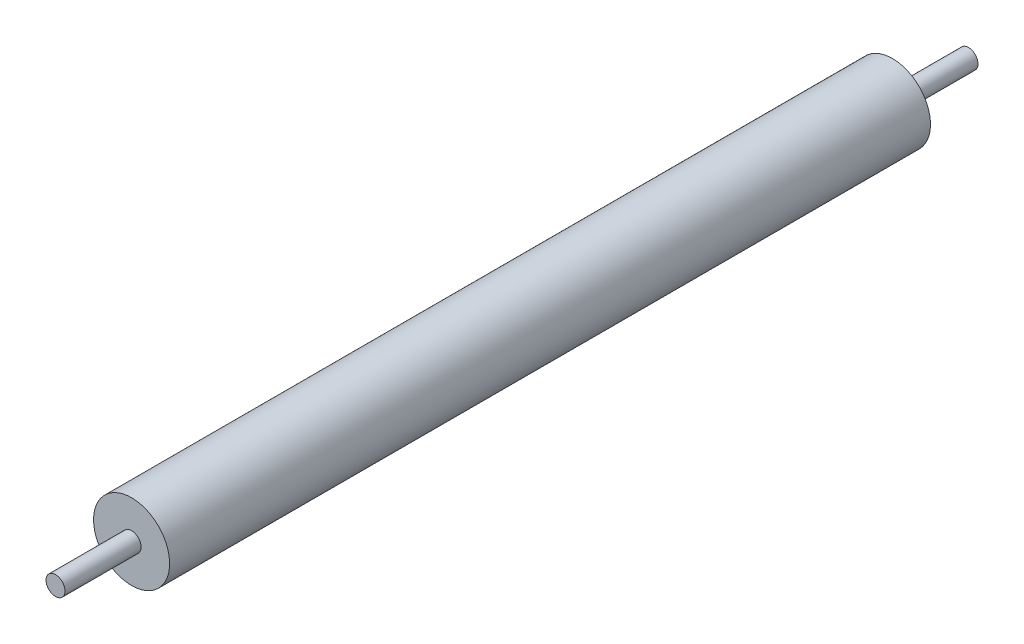
ISO-10303-21;
HEADER;
FILE_DESCRIPTION(('STEP AP214'),'2;1');
FILE_NAME('part.step','',(''),(''),'','','');
FILE_SCHEMA(('AUTOMOTIVE_DESIGN { 1 0 10303 214 1 1 1 1 }'));
ENDSEC;
DATA;
#1=APPLICATION_CONTEXT('core data for automotive mechanical design processes');
#2=APPLICATION_PROTOCOL_DEFINITION('international standard','automotive_design',2000,#1);
#3=PRODUCT_CONTEXT('',#1,'mechanical');
#4=PRODUCT('Part','Part','',(#3));
#5=PRODUCT_RELATED_PRODUCT_CATEGORY('part','',(#4));
#6=PRODUCT_DEFINITION_FORMATION('','',#4);
#7=PRODUCT_DEFINITION_CONTEXT('part definition',#1,'design');
#8=PRODUCT_DEFINITION('design','',#6,#7);
#9=PRODUCT_DEFINITION_SHAPE('','',#8);
#10=(LENGTH_UNIT() NAMED_UNIT(*) SI_UNIT(.MILLI.,.METRE.));
#11=(NAMED_UNIT(*) PLANE_ANGLE_UNIT() SI_UNIT($,.RADIAN.));
#12=(NAMED_UNIT(*) SI_UNIT($,.STERADIAN.) SOLID_ANGLE_UNIT());
#13=UNCERTAINTY_MEASURE_WITH_UNIT(LENGTH_MEASURE(1.E-05),#10,'distance_accuracy_value','');
#14=(GEOMETRIC_REPRESENTATION_CONTEXT(3) GLOBAL_UNCERTAINTY_ASSIGNED_CONTEXT((#13)) GLOBAL_UNIT_ASSIGNED_CONTEXT((#10,
#11,#12)) REPRESENTATION_CONTEXT('',''));
#15=CARTESIAN_POINT('',(0.,0.,0.));
#16=DIRECTION('',(0.,0.,1.));
#17=DIRECTION('',(1.,0.,0.));
#18=AXIS2_PLACEMENT_3D('',#15,#16,#17);
#19=CARTESIAN_POINT('',(0.,0.,120.));
#20=DIRECTION('',(0.,0.,1.));
#21=DIRECTION('',(1.,0.,0.));
#22=AXIS2_PLACEMENT_3D('',#19,#20,#21);
#23=PLANE('',#22);
#24=CARTESIAN_POINT('',(0.,0.,120.));
#25=DIRECTION('',(0.,0.,-1.));
#26=DIRECTION('',(-1.,0.,0.));
#27=AXIS2_PLACEMENT_3D('',#24,#25,#26);
#28=CIRCLE('',#27,2.50000000000002);
#29=CARTESIAN_POINT('',(-2.49999999999999,0.,120.));
#30=VERTEX_POINT('',#29);
#31=EDGE_CURVE('E10',#30,#30,#28,.T.);
#32=ORIENTED_EDGE('',*,*,#31,.F.);
#33=EDGE_LOOP('',(#32));
#34=FACE_BOUND('',#33,.T.);
#35=ADVANCED_FACE('F33',(#34),#23,.T.);
#36=CARTESIAN_POINT('',(0.,0.,-120.));
#37=DIRECTION('',(0.,0.,-1.));
#38=DIRECTION('',(-1.,0.,0.));
#39=AXIS2_PLACEMENT_3D('',#36,#37,#38);
#40=CYLINDRICAL_SURFACE('',#39,2.50000000000002);
#41=ORIENTED_EDGE('',*,*,#31,.T.);
#42=EDGE_LOOP('',(#41));
#43=FACE_BOUND('',#42,.T.);
#44=CARTESIAN_POINT('',(0.,0.,100.));
#45=DIRECTION('',(0.,0.,-1.));
#46=DIRECTION('',(-1.,0.,0.));
#47=AXIS2_PLACEMENT_3D('',#44,#45,#46);
#48=CIRCLE('',#47,2.50000000000002);
#49=CARTESIAN_POINT('',(-2.49999999999999,0.,100.));
#50=VERTEX_POINT('',#49);
#51=EDGE_CURVE('E39',#50,#50,#48,.T.);
#52=ORIENTED_EDGE('',*,*,#51,.F.);
#53=EDGE_LOOP('',(#52));
#54=FACE_BOUND('',#53,.T.);
#55=ADVANCED_FACE('F75',(#43,#54),#40,.T.);
#56=CARTESIAN_POINT('',(-2.49999999999999,0.,100.));
#57=DIRECTION('',(0.,0.,1.));
#58=DIRECTION('',(1.,0.,0.));
#59=AXIS2_PLACEMENT_3D('',#56,#57,#58);
#60=PLANE('',#59);
#61=ORIENTED_EDGE('',*,*,#51,.T.);
#62=EDGE_LOOP('',(#61));
#63=FACE_BOUND('',#62,.T.);
#64=CARTESIAN_POINT('',(0.,0.,100.));
#65=DIRECTION('',(0.,0.,-1.));
#66=DIRECTION('',(-1.,0.,0.));
#67=AXIS2_PLACEMENT_3D('',#64,#65,#66);
#68=CIRCLE('',#67,10.0000000000001);
#69=CARTESIAN_POINT('',(-10.,0.,100.));
#70=VERTEX_POINT('',#69);
#71=EDGE_CURVE('E43',#70,#70,#68,.T.);
#72=ORIENTED_EDGE('',*,*,#71,.F.);
#73=EDGE_LOOP('',(#72));
#74=FACE_BOUND('',#73,.T.);
#75=ADVANCED_FACE('F80',(#63,#74),#60,.T.);
#76=CARTESIAN_POINT('',(0.,0.,-120.));
#77=DIRECTION('',(0.,0.,-1.));
#78=DIRECTION('',(-1.,0.,0.));
#79=AXIS2_PLACEMENT_3D('',#76,#77,#78);
#80=CYLINDRICAL_SURFACE('',#79,10.);
#81=ORIENTED_EDGE('',*,*,#71,.T.);
#82=EDGE_LOOP('',(#81));
#83=FACE_BOUND('',#82,.T.);
#84=CARTESIAN_POINT('',(0.,0.,-100.));
#85=DIRECTION('',(0.,0.,-1.));
#86=DIRECTION('',(-1.,0.,0.));
#87=AXIS2_PLACEMENT_3D('',#84,#85,#86);
#88=CIRCLE('',#87,10.);
#89=CARTESIAN_POINT('',(-10.,0.,-100.));
#90=VERTEX_POINT('',#89);
#91=EDGE_CURVE('E47',#90,#90,#88,.T.);
#92=ORIENTED_EDGE('',*,*,#91,.F.);
#93=EDGE_LOOP('',(#92));
#94=FACE_BOUND('',#93,.T.);
#95=ADVANCED_FACE('F71',(#83,#94),#80,.T.);
#96=CARTESIAN_POINT('',(-10.,0.,-100.));
#97=DIRECTION('',(0.,0.,-1.));
#98=DIRECTION('',(-1.,0.,0.));
#99=AXIS2_PLACEMENT_3D('',#96,#97,#98);
#100=PLANE('',#99);
#101=ORIENTED_EDGE('',*,*,#91,.T.);
#102=EDGE_LOOP('',(#101));
#103=FACE_BOUND('',#102,.T.);
#104=CARTESIAN_POINT('',(0.,0.,-100.));
#105=DIRECTION('',(0.,0.,-1.));
#106=DIRECTION('',(-1.,0.,0.));
#107=AXIS2_PLACEMENT_3D('',#104,#105,#106);
#108=CIRCLE('',#107,2.50000000000001);
#109=CARTESIAN_POINT('',(-2.49999999999998,0.,-100.));
#110=VERTEX_POINT('',#109);
#111=EDGE_CURVE('E52',#110,#110,#108,.T.);
#112=ORIENTED_EDGE('',*,*,#111,.F.);
#113=EDGE_LOOP('',(#112));
#114=FACE_BOUND('',#113,.T.);
#115=ADVANCED_FACE('F63',(#103,#114),#100,.T.);
#116=CARTESIAN_POINT('',(0.,0.,-120.));
#117=DIRECTION('',(0.,0.,-1.));
#118=DIRECTION('',(-1.,0.,0.));
#119=AXIS2_PLACEMENT_3D('',#116,#117,#118);
#120=CYLINDRICAL_SURFACE('',#119,2.50000000000002);
#121=ORIENTED_EDGE('',*,*,#111,.T.);
#122=EDGE_LOOP('',(#121));
#123=FACE_BOUND('',#122,.T.);
#124=CARTESIAN_POINT('',(0.,0.,-120.));
#125=DIRECTION('',(0.,0.,-1.));
#126=DIRECTION('',(-1.,0.,0.));
#127=AXIS2_PLACEMENT_3D('',#124,#125,#126);
#128=CIRCLE('',#127,2.50000000000002);
#129=CARTESIAN_POINT('',(-2.49999999999999,0.,-120.));
#130=VERTEX_POINT('',#129);
#131=EDGE_CURVE('E55',#130,#130,#128,.T.);
#132=ORIENTED_EDGE('',*,*,#131,.F.);
#133=EDGE_LOOP('',(#132));
#134=FACE_BOUND('',#133,.T.);
#135=ADVANCED_FACE('F61',(#123,#134),#120,.T.);
#136=CARTESIAN_POINT('',(-2.49999999999999,0.,-120.));
#137=DIRECTION('',(0.,0.,-1.));
#138=DIRECTION('',(-1.,0.,0.));
#139=AXIS2_PLACEMENT_3D('',#136,#137,#138);
#140=PLANE('',#139);
#141=ORIENTED_EDGE('',*,*,#131,.T.);
#142=EDGE_LOOP('',(#141));
#143=FACE_BOUND('',#142,.T.);
#144=ADVANCED_FACE('F59',(#143),#140,.T.);
#145=CLOSED_SHELL('',(#35,#55,#75,#95,#115,#135,#144));
#146=MANIFOLD_SOLID_BREP('B2',#145);
#147=ADVANCED_BREP_SHAPE_REPRESENTATION('',(#18,#146),#14);
#148=SHAPE_DEFINITION_REPRESENTATION(#9,#147);
ENDSEC;
END-ISO-10303-21;
